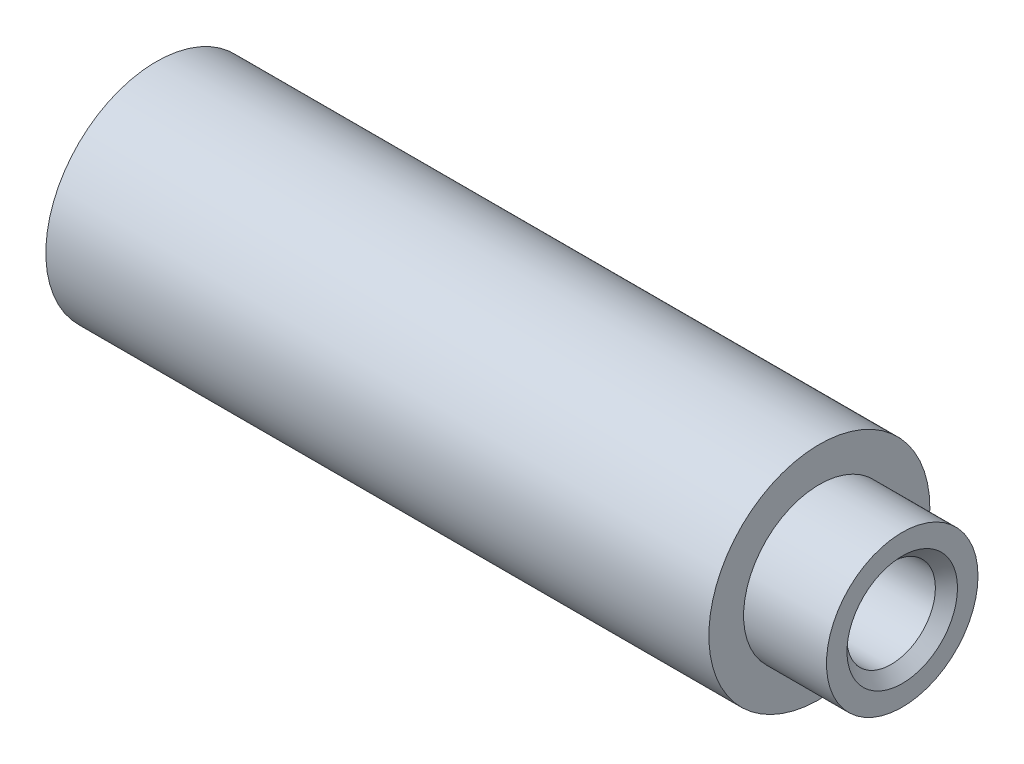
ISO-10303-21;
HEADER;
FILE_DESCRIPTION(('STEP AP214'),'2;1');
FILE_NAME('part.step','',(''),(''),'','','');
FILE_SCHEMA(('AUTOMOTIVE_DESIGN { 1 0 10303 214 1 1 1 1 }'));
ENDSEC;
DATA;
#1=APPLICATION_CONTEXT('core data for automotive mechanical design processes');
#2=APPLICATION_PROTOCOL_DEFINITION('international standard','automotive_design',2000,#1);
#3=PRODUCT_CONTEXT('',#1,'mechanical');
#4=PRODUCT('Part','Part','',(#3));
#5=PRODUCT_RELATED_PRODUCT_CATEGORY('part','',(#4));
#6=PRODUCT_DEFINITION_FORMATION('','',#4);
#7=PRODUCT_DEFINITION_CONTEXT('part definition',#1,'design');
#8=PRODUCT_DEFINITION('design','',#6,#7);
#9=PRODUCT_DEFINITION_SHAPE('','',#8);
#10=(LENGTH_UNIT() NAMED_UNIT(*) SI_UNIT(.MILLI.,.METRE.));
#11=(NAMED_UNIT(*) PLANE_ANGLE_UNIT() SI_UNIT($,.RADIAN.));
#12=(NAMED_UNIT(*) SI_UNIT($,.STERADIAN.) SOLID_ANGLE_UNIT());
#13=UNCERTAINTY_MEASURE_WITH_UNIT(LENGTH_MEASURE(1.E-05),#10,'distance_accuracy_value','');
#14=(GEOMETRIC_REPRESENTATION_CONTEXT(3) GLOBAL_UNCERTAINTY_ASSIGNED_CONTEXT((#13)) GLOBAL_UNIT_ASSIGNED_CONTEXT((#10,
#11,#12)) REPRESENTATION_CONTEXT('',''));
#15=CARTESIAN_POINT('',(0.,0.,0.));
#16=DIRECTION('',(0.,0.,1.));
#17=DIRECTION('',(1.,0.,0.));
#18=AXIS2_PLACEMENT_3D('',#15,#16,#17);
#19=CARTESIAN_POINT('',(27.,0.,0.));
#20=DIRECTION('',(1.,0.,0.));
#21=DIRECTION('',(0.,0.,-1.));
#22=AXIS2_PLACEMENT_3D('',#19,#20,#21);
#23=PLANE('',#22);
#24=CARTESIAN_POINT('',(27.,0.,0.));
#25=DIRECTION('',(1.,0.,0.));
#26=DIRECTION('',(0.,0.,-1.));
#27=AXIS2_PLACEMENT_3D('',#24,#25,#26);
#28=CIRCLE('',#27,2.);
#29=CARTESIAN_POINT('',(27.,0.,-2.));
#30=VERTEX_POINT('',#29);
#31=EDGE_CURVE('E11',#30,#30,#28,.F.);
#32=ORIENTED_EDGE('',*,*,#31,.T.);
#33=EDGE_LOOP('',(#32));
#34=FACE_BOUND('',#33,.T.);
#35=CARTESIAN_POINT('',(27.,0.,0.));
#36=DIRECTION('',(1.,0.,0.));
#37=DIRECTION('',(0.,0.,-1.));
#38=AXIS2_PLACEMENT_3D('',#35,#36,#37);
#39=CIRCLE('',#38,2.7425);
#40=CARTESIAN_POINT('',(27.,0.,-2.7425));
#41=VERTEX_POINT('',#40);
#42=EDGE_CURVE('E70',#41,#41,#39,.T.);
#43=ORIENTED_EDGE('',*,*,#42,.T.);
#44=EDGE_LOOP('',(#43));
#45=FACE_BOUND('',#44,.T.);
#46=ADVANCED_FACE('F45',(#34,#45),#23,.T.);
#47=CARTESIAN_POINT('',(27.,0.,0.));
#48=DIRECTION('',(-1.,0.,0.));
#49=DIRECTION('',(0.,0.,1.));
#50=AXIS2_PLACEMENT_3D('',#47,#48,#49);
#51=CYLINDRICAL_SURFACE('',#50,4.);
#52=CARTESIAN_POINT('',(0.,0.,0.));
#53=DIRECTION('',(1.,0.,0.));
#54=DIRECTION('',(0.,0.,-1.));
#55=AXIS2_PLACEMENT_3D('',#52,#53,#54);
#56=CIRCLE('',#55,4.);
#57=CARTESIAN_POINT('',(0.,0.,-4.));
#58=VERTEX_POINT('',#57);
#59=EDGE_CURVE('E65',#58,#58,#56,.T.);
#60=ORIENTED_EDGE('',*,*,#59,.T.);
#61=EDGE_LOOP('',(#60));
#62=FACE_BOUND('',#61,.T.);
#63=CARTESIAN_POINT('',(24.,0.,0.));
#64=DIRECTION('',(1.,0.,0.));
#65=DIRECTION('',(0.,0.,-1.));
#66=AXIS2_PLACEMENT_3D('',#63,#64,#65);
#67=CIRCLE('',#66,4.);
#68=CARTESIAN_POINT('',(24.,0.,-4.));
#69=VERTEX_POINT('',#68);
#70=EDGE_CURVE('E61',#69,#69,#67,.T.);
#71=ORIENTED_EDGE('',*,*,#70,.F.);
#72=EDGE_LOOP('',(#71));
#73=FACE_BOUND('',#72,.T.);
#74=ADVANCED_FACE('F88',(#62,#73),#51,.T.);
#75=CARTESIAN_POINT('',(0.,0.,0.));
#76=DIRECTION('',(1.,0.,0.));
#77=DIRECTION('',(0.,0.,-1.));
#78=AXIS2_PLACEMENT_3D('',#75,#76,#77);
#79=PLANE('',#78);
#80=CARTESIAN_POINT('',(0.,0.,0.));
#81=DIRECTION('',(1.,0.,0.));
#82=DIRECTION('',(0.,0.,-1.));
#83=AXIS2_PLACEMENT_3D('',#80,#81,#82);
#84=CIRCLE('',#83,2.);
#85=CARTESIAN_POINT('',(0.,0.,-2.));
#86=VERTEX_POINT('',#85);
#87=EDGE_CURVE('E59',#86,#86,#84,.T.);
#88=ORIENTED_EDGE('',*,*,#87,.T.);
#89=EDGE_LOOP('',(#88));
#90=FACE_BOUND('',#89,.T.);
#91=ORIENTED_EDGE('',*,*,#59,.F.);
#92=EDGE_LOOP('',(#91));
#93=FACE_BOUND('',#92,.T.);
#94=ADVANCED_FACE('F86',(#90,#93),#79,.F.);
#95=CARTESIAN_POINT('',(27.,0.,0.));
#96=DIRECTION('',(-1.,0.,0.));
#97=DIRECTION('',(0.,0.,1.));
#98=AXIS2_PLACEMENT_3D('',#95,#96,#97);
#99=CYLINDRICAL_SURFACE('',#98,1.6);
#100=CARTESIAN_POINT('',(0.400000000000001,0.,0.));
#101=DIRECTION('',(1.,0.,0.));
#102=DIRECTION('',(0.,0.,-1.));
#103=AXIS2_PLACEMENT_3D('',#100,#101,#102);
#104=CIRCLE('',#103,1.6);
#105=CARTESIAN_POINT('',(0.400000000000001,0.,-1.6));
#106=VERTEX_POINT('',#105);
#107=EDGE_CURVE('E49',#106,#106,#104,.F.);
#108=ORIENTED_EDGE('',*,*,#107,.T.);
#109=EDGE_LOOP('',(#108));
#110=FACE_BOUND('',#109,.T.);
#111=CARTESIAN_POINT('',(26.6,0.,0.));
#112=DIRECTION('',(1.,0.,0.));
#113=DIRECTION('',(0.,0.,-1.));
#114=AXIS2_PLACEMENT_3D('',#111,#112,#113);
#115=CIRCLE('',#114,1.6);
#116=CARTESIAN_POINT('',(26.6,0.,-1.6));
#117=VERTEX_POINT('',#116);
#118=EDGE_CURVE('E53',#117,#117,#115,.T.);
#119=ORIENTED_EDGE('',*,*,#118,.T.);
#120=EDGE_LOOP('',(#119));
#121=FACE_BOUND('',#120,.T.);
#122=ADVANCED_FACE('F82',(#110,#121),#99,.F.);
#123=CARTESIAN_POINT('',(24.,0.,0.));
#124=DIRECTION('',(1.,0.,0.));
#125=DIRECTION('',(0.,0.,-1.));
#126=AXIS2_PLACEMENT_3D('',#123,#124,#125);
#127=PLANE('',#126);
#128=CARTESIAN_POINT('',(24.,0.,0.));
#129=DIRECTION('',(1.,0.,0.));
#130=DIRECTION('',(0.,0.,-1.));
#131=AXIS2_PLACEMENT_3D('',#128,#129,#130);
#132=CIRCLE('',#131,2.7425);
#133=CARTESIAN_POINT('',(24.,0.,-2.7425));
#134=VERTEX_POINT('',#133);
#135=EDGE_CURVE('E67',#134,#134,#132,.T.);
#136=ORIENTED_EDGE('',*,*,#135,.F.);
#137=EDGE_LOOP('',(#136));
#138=FACE_BOUND('',#137,.T.);
#139=ORIENTED_EDGE('',*,*,#70,.T.);
#140=EDGE_LOOP('',(#139));
#141=FACE_BOUND('',#140,.T.);
#142=ADVANCED_FACE('F76',(#138,#141),#127,.T.);
#143=CARTESIAN_POINT('',(24.,0.,0.));
#144=DIRECTION('',(1.,0.,0.));
#145=DIRECTION('',(0.,0.,-1.));
#146=AXIS2_PLACEMENT_3D('',#143,#144,#145);
#147=CYLINDRICAL_SURFACE('',#146,2.7425);
#148=ORIENTED_EDGE('',*,*,#135,.T.);
#149=EDGE_LOOP('',(#148));
#150=FACE_BOUND('',#149,.T.);
#151=ORIENTED_EDGE('',*,*,#42,.F.);
#152=EDGE_LOOP('',(#151));
#153=FACE_BOUND('',#152,.T.);
#154=ADVANCED_FACE('F77',(#150,#153),#147,.T.);
#155=CARTESIAN_POINT('',(0.,0.,0.));
#156=DIRECTION('',(-1.,0.,0.));
#157=DIRECTION('',(0.,0.,1.));
#158=AXIS2_PLACEMENT_3D('',#155,#156,#157);
#159=CONICAL_SURFACE('',#158,2.,0.785398163397445);
#160=ORIENTED_EDGE('',*,*,#107,.F.);
#161=EDGE_LOOP('',(#160));
#162=FACE_BOUND('',#161,.T.);
#163=ORIENTED_EDGE('',*,*,#87,.F.);
#164=EDGE_LOOP('',(#163));
#165=FACE_BOUND('',#164,.T.);
#166=ADVANCED_FACE('F97',(#162,#165),#159,.F.);
#167=CARTESIAN_POINT('',(26.6,0.,0.));
#168=DIRECTION('',(1.,0.,0.));
#169=DIRECTION('',(0.,0.,-1.));
#170=AXIS2_PLACEMENT_3D('',#167,#168,#169);
#171=CONICAL_SURFACE('',#170,1.6,0.785398163397449);
#172=ORIENTED_EDGE('',*,*,#31,.F.);
#173=EDGE_LOOP('',(#172));
#174=FACE_BOUND('',#173,.T.);
#175=ORIENTED_EDGE('',*,*,#118,.F.);
#176=EDGE_LOOP('',(#175));
#177=FACE_BOUND('',#176,.T.);
#178=ADVANCED_FACE('F44',(#174,#177),#171,.F.);
#179=CLOSED_SHELL('',(#46,#74,#94,#122,#142,#154,#166,#178));
#180=MANIFOLD_SOLID_BREP('B2',#179);
#181=ADVANCED_BREP_SHAPE_REPRESENTATION('',(#18,#180),#14);
#182=SHAPE_DEFINITION_REPRESENTATION(#9,#181);
ENDSEC;
END-ISO-10303-21;
